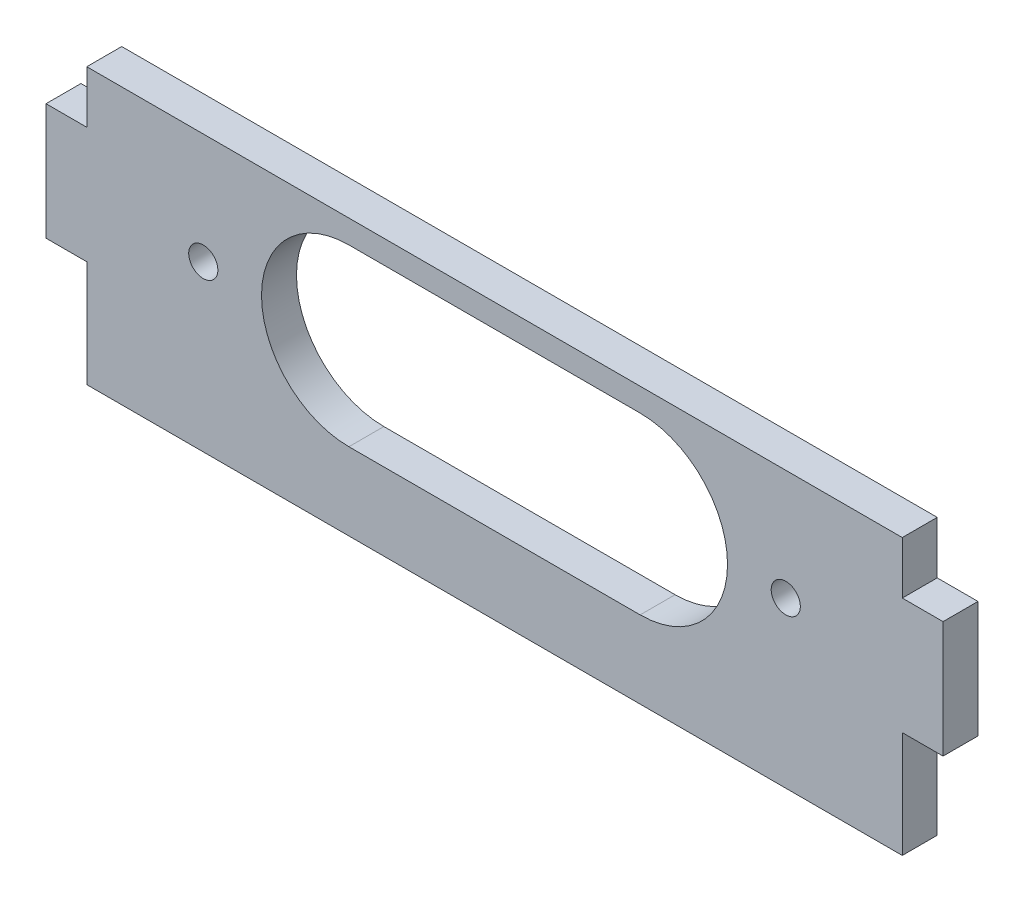
ISO-10303-21;
HEADER;
FILE_DESCRIPTION(('STEP AP214'),'2;1');
FILE_NAME('part.step','',(''),(''),'','','');
FILE_SCHEMA(('AUTOMOTIVE_DESIGN { 1 0 10303 214 1 1 1 1 }'));
ENDSEC;
DATA;
#1=APPLICATION_CONTEXT('core data for automotive mechanical design processes');
#2=APPLICATION_PROTOCOL_DEFINITION('international standard','automotive_design',2000,#1);
#3=PRODUCT_CONTEXT('',#1,'mechanical');
#4=PRODUCT('Part','Part','',(#3));
#5=PRODUCT_RELATED_PRODUCT_CATEGORY('part','',(#4));
#6=PRODUCT_DEFINITION_FORMATION('','',#4);
#7=PRODUCT_DEFINITION_CONTEXT('part definition',#1,'design');
#8=PRODUCT_DEFINITION('design','',#6,#7);
#9=PRODUCT_DEFINITION_SHAPE('','',#8);
#10=(LENGTH_UNIT() NAMED_UNIT(*) SI_UNIT(.MILLI.,.METRE.));
#11=(NAMED_UNIT(*) PLANE_ANGLE_UNIT() SI_UNIT($,.RADIAN.));
#12=(NAMED_UNIT(*) SI_UNIT($,.STERADIAN.) SOLID_ANGLE_UNIT());
#13=UNCERTAINTY_MEASURE_WITH_UNIT(LENGTH_MEASURE(1.E-05),#10,'distance_accuracy_value','');
#14=(GEOMETRIC_REPRESENTATION_CONTEXT(3) GLOBAL_UNCERTAINTY_ASSIGNED_CONTEXT((#13)) GLOBAL_UNIT_ASSIGNED_CONTEXT((#10,
#11,#12)) REPRESENTATION_CONTEXT('',''));
#15=CARTESIAN_POINT('',(0.,0.,0.));
#16=DIRECTION('',(0.,0.,1.));
#17=DIRECTION('',(1.,0.,0.));
#18=AXIS2_PLACEMENT_3D('',#15,#16,#17);
#19=CARTESIAN_POINT('',(0.,0.,6.));
#20=DIRECTION('',(0.,0.,1.));
#21=DIRECTION('',(1.,0.,0.));
#22=AXIS2_PLACEMENT_3D('',#19,#20,#21);
#23=PLANE('',#22);
#24=CARTESIAN_POINT('',(120.,-19.,6.));
#25=DIRECTION('',(0.,0.,1.));
#26=DIRECTION('',(1.,0.,0.));
#27=AXIS2_PLACEMENT_3D('',#24,#25,#26);
#28=CIRCLE('',#27,2.50000000000001);
#29=CARTESIAN_POINT('',(122.5,-19.,6.));
#30=VERTEX_POINT('',#29);
#31=EDGE_CURVE('E188',#30,#30,#28,.T.);
#32=ORIENTED_EDGE('',*,*,#31,.F.);
#33=EDGE_LOOP('',(#32));
#34=FACE_BOUND('',#33,.T.);
#35=DIRECTION('',(0.,1.,0.));
#36=VECTOR('',#35,1.);
#37=CARTESIAN_POINT('',(140.,-9.00000000000001,6.));
#38=LINE('',#37,#36);
#39=CARTESIAN_POINT('',(140.,-9.00000000000001,6.));
#40=VERTEX_POINT('',#39);
#41=CARTESIAN_POINT('',(140.,0.,6.));
#42=VERTEX_POINT('',#41);
#43=EDGE_CURVE('E204',#40,#42,#38,.T.);
#44=ORIENTED_EDGE('',*,*,#43,.T.);
#45=DIRECTION('',(-1.,0.,0.));
#46=VECTOR('',#45,1.);
#47=CARTESIAN_POINT('',(140.,0.,6.));
#48=LINE('',#47,#46);
#49=CARTESIAN_POINT('',(0.,0.,6.));
#50=VERTEX_POINT('',#49);
#51=EDGE_CURVE('E208',#42,#50,#48,.T.);
#52=ORIENTED_EDGE('',*,*,#51,.T.);
#53=DIRECTION('',(0.,-1.,0.));
#54=VECTOR('',#53,1.);
#55=CARTESIAN_POINT('',(0.,0.,6.));
#56=LINE('',#55,#54);
#57=CARTESIAN_POINT('',(0.,-9.00000000000001,6.));
#58=VERTEX_POINT('',#57);
#59=EDGE_CURVE('E212',#50,#58,#56,.T.);
#60=ORIENTED_EDGE('',*,*,#59,.T.);
#61=DIRECTION('',(-1.,0.,0.));
#62=VECTOR('',#61,1.);
#63=CARTESIAN_POINT('',(0.,-9.00000000000001,6.));
#64=LINE('',#63,#62);
#65=CARTESIAN_POINT('',(-7.00000000000001,-9.00000000000001,6.));
#66=VERTEX_POINT('',#65);
#67=EDGE_CURVE('E215',#58,#66,#64,.T.);
#68=ORIENTED_EDGE('',*,*,#67,.T.);
#69=DIRECTION('',(0.,-1.,0.));
#70=VECTOR('',#69,1.);
#71=CARTESIAN_POINT('',(-7.00000000000001,-9.00000000000001,6.));
#72=LINE('',#71,#70);
#73=CARTESIAN_POINT('',(-7.00000000000001,-29.,6.));
#74=VERTEX_POINT('',#73);
#75=EDGE_CURVE('E218',#66,#74,#72,.T.);
#76=ORIENTED_EDGE('',*,*,#75,.T.);
#77=DIRECTION('',(1.,0.,0.));
#78=VECTOR('',#77,1.);
#79=CARTESIAN_POINT('',(-7.00000000000001,-29.,6.));
#80=LINE('',#79,#78);
#81=CARTESIAN_POINT('',(0.,-29.,6.));
#82=VERTEX_POINT('',#81);
#83=EDGE_CURVE('E221',#74,#82,#80,.T.);
#84=ORIENTED_EDGE('',*,*,#83,.T.);
#85=DIRECTION('',(0.,-1.,0.));
#86=VECTOR('',#85,1.);
#87=CARTESIAN_POINT('',(0.,-29.,6.));
#88=LINE('',#87,#86);
#89=CARTESIAN_POINT('',(0.,-47.27,6.));
#90=VERTEX_POINT('',#89);
#91=EDGE_CURVE('E224',#82,#90,#88,.T.);
#92=ORIENTED_EDGE('',*,*,#91,.T.);
#93=DIRECTION('',(1.,0.,0.));
#94=VECTOR('',#93,1.);
#95=CARTESIAN_POINT('',(0.,-47.27,6.));
#96=LINE('',#95,#94);
#97=CARTESIAN_POINT('',(140.,-47.27,6.));
#98=VERTEX_POINT('',#97);
#99=EDGE_CURVE('E227',#90,#98,#96,.T.);
#100=ORIENTED_EDGE('',*,*,#99,.T.);
#101=DIRECTION('',(0.,1.,0.));
#102=VECTOR('',#101,1.);
#103=CARTESIAN_POINT('',(140.,-47.27,6.));
#104=LINE('',#103,#102);
#105=CARTESIAN_POINT('',(140.,-29.,6.));
#106=VERTEX_POINT('',#105);
#107=EDGE_CURVE('E230',#98,#106,#104,.T.);
#108=ORIENTED_EDGE('',*,*,#107,.T.);
#109=DIRECTION('',(1.,0.,0.));
#110=VECTOR('',#109,1.);
#111=CARTESIAN_POINT('',(140.,-29.,6.));
#112=LINE('',#111,#110);
#113=CARTESIAN_POINT('',(147.,-29.,6.));
#114=VERTEX_POINT('',#113);
#115=EDGE_CURVE('E233',#106,#114,#112,.T.);
#116=ORIENTED_EDGE('',*,*,#115,.T.);
#117=DIRECTION('',(0.,1.,0.));
#118=VECTOR('',#117,1.);
#119=CARTESIAN_POINT('',(147.,-29.,6.));
#120=LINE('',#119,#118);
#121=CARTESIAN_POINT('',(147.,-9.00000000000001,6.));
#122=VERTEX_POINT('',#121);
#123=EDGE_CURVE('E236',#114,#122,#120,.T.);
#124=ORIENTED_EDGE('',*,*,#123,.T.);
#125=DIRECTION('',(-1.,0.,0.));
#126=VECTOR('',#125,1.);
#127=CARTESIAN_POINT('',(147.,-9.00000000000001,6.));
#128=LINE('',#127,#126);
#129=EDGE_CURVE('E239',#122,#40,#128,.T.);
#130=ORIENTED_EDGE('',*,*,#129,.T.);
#131=EDGE_LOOP('',(#44,#52,#60,#68,#76,#84,#92,#100,#108,#116,#124,#130));
#132=FACE_BOUND('',#131,.T.);
#133=DIRECTION('',(-1.,0.,0.));
#134=VECTOR('',#133,1.);
#135=CARTESIAN_POINT('',(94.9999999999999,-4.,6.));
#136=LINE('',#135,#134);
#137=CARTESIAN_POINT('',(94.9999999999999,-4.,6.));
#138=VERTEX_POINT('',#137);
#139=CARTESIAN_POINT('',(44.9999999999999,-4.00000000000003,6.));
#140=VERTEX_POINT('',#139);
#141=EDGE_CURVE('E162',#138,#140,#136,.T.);
#142=ORIENTED_EDGE('',*,*,#141,.F.);
#143=CARTESIAN_POINT('',(94.9999999999999,-19.,6.));
#144=DIRECTION('',(0.,0.,1.));
#145=DIRECTION('',(1.,0.,0.));
#146=AXIS2_PLACEMENT_3D('',#143,#144,#145);
#147=CIRCLE('',#146,15.);
#148=CARTESIAN_POINT('',(94.9999999999999,-34.,6.));
#149=VERTEX_POINT('',#148);
#150=EDGE_CURVE('E153',#149,#138,#147,.T.);
#151=ORIENTED_EDGE('',*,*,#150,.F.);
#152=DIRECTION('',(1.,0.,0.));
#153=VECTOR('',#152,1.);
#154=CARTESIAN_POINT('',(44.9999999999999,-34.,6.));
#155=LINE('',#154,#153);
#156=CARTESIAN_POINT('',(44.9999999999999,-34.,6.));
#157=VERTEX_POINT('',#156);
#158=EDGE_CURVE('E180',#157,#149,#155,.T.);
#159=ORIENTED_EDGE('',*,*,#158,.F.);
#160=CARTESIAN_POINT('',(44.9999999999999,-19.,6.));
#161=DIRECTION('',(0.,0.,1.));
#162=DIRECTION('',(1.,0.,0.));
#163=AXIS2_PLACEMENT_3D('',#160,#161,#162);
#164=CIRCLE('',#163,15.);
#165=EDGE_CURVE('E176',#140,#157,#164,.T.);
#166=ORIENTED_EDGE('',*,*,#165,.F.);
#167=EDGE_LOOP('',(#142,#151,#159,#166));
#168=FACE_BOUND('',#167,.T.);
#169=CARTESIAN_POINT('',(19.9999999999999,-19.,6.));
#170=DIRECTION('',(0.,0.,1.));
#171=DIRECTION('',(1.,0.,0.));
#172=AXIS2_PLACEMENT_3D('',#169,#170,#171);
#173=CIRCLE('',#172,2.5);
#174=CARTESIAN_POINT('',(22.4999999999999,-19.,6.));
#175=VERTEX_POINT('',#174);
#176=EDGE_CURVE('E549',#175,#175,#173,.T.);
#177=ORIENTED_EDGE('',*,*,#176,.F.);
#178=EDGE_LOOP('',(#177));
#179=FACE_BOUND('',#178,.T.);
#180=ADVANCED_FACE('F39',(#34,#132,#168,#179),#23,.T.);
#181=CARTESIAN_POINT('',(0.,0.,0.));
#182=DIRECTION('',(0.,0.,1.));
#183=DIRECTION('',(1.,0.,0.));
#184=AXIS2_PLACEMENT_3D('',#181,#182,#183);
#185=PLANE('',#184);
#186=DIRECTION('',(0.,1.,0.));
#187=VECTOR('',#186,1.);
#188=CARTESIAN_POINT('',(140.,-9.00000000000001,0.));
#189=LINE('',#188,#187);
#190=CARTESIAN_POINT('',(140.,-9.00000000000001,0.));
#191=VERTEX_POINT('',#190);
#192=CARTESIAN_POINT('',(140.,0.,0.));
#193=VERTEX_POINT('',#192);
#194=EDGE_CURVE('E171',#191,#193,#189,.T.);
#195=ORIENTED_EDGE('',*,*,#194,.F.);
#196=DIRECTION('',(-1.,0.,0.));
#197=VECTOR('',#196,1.);
#198=CARTESIAN_POINT('',(147.,-9.00000000000001,0.));
#199=LINE('',#198,#197);
#200=CARTESIAN_POINT('',(147.,-9.00000000000001,0.));
#201=VERTEX_POINT('',#200);
#202=EDGE_CURVE('E209',#201,#191,#199,.T.);
#203=ORIENTED_EDGE('',*,*,#202,.F.);
#204=DIRECTION('',(0.,1.,0.));
#205=VECTOR('',#204,1.);
#206=CARTESIAN_POINT('',(147.,-29.,0.));
#207=LINE('',#206,#205);
#208=CARTESIAN_POINT('',(147.,-29.,0.));
#209=VERTEX_POINT('',#208);
#210=EDGE_CURVE('E273',#209,#201,#207,.T.);
#211=ORIENTED_EDGE('',*,*,#210,.F.);
#212=DIRECTION('',(1.,0.,0.));
#213=VECTOR('',#212,1.);
#214=CARTESIAN_POINT('',(140.,-29.,0.));
#215=LINE('',#214,#213);
#216=CARTESIAN_POINT('',(140.,-29.,0.));
#217=VERTEX_POINT('',#216);
#218=EDGE_CURVE('E270',#217,#209,#215,.T.);
#219=ORIENTED_EDGE('',*,*,#218,.F.);
#220=DIRECTION('',(0.,1.,0.));
#221=VECTOR('',#220,1.);
#222=CARTESIAN_POINT('',(140.,-47.27,0.));
#223=LINE('',#222,#221);
#224=CARTESIAN_POINT('',(140.,-47.27,0.));
#225=VERTEX_POINT('',#224);
#226=EDGE_CURVE('E267',#225,#217,#223,.T.);
#227=ORIENTED_EDGE('',*,*,#226,.F.);
#228=DIRECTION('',(1.,0.,0.));
#229=VECTOR('',#228,1.);
#230=CARTESIAN_POINT('',(0.,-47.27,0.));
#231=LINE('',#230,#229);
#232=CARTESIAN_POINT('',(0.,-47.27,0.));
#233=VERTEX_POINT('',#232);
#234=EDGE_CURVE('E264',#233,#225,#231,.T.);
#235=ORIENTED_EDGE('',*,*,#234,.F.);
#236=DIRECTION('',(0.,-1.,0.));
#237=VECTOR('',#236,1.);
#238=CARTESIAN_POINT('',(0.,-29.,0.));
#239=LINE('',#238,#237);
#240=CARTESIAN_POINT('',(0.,-29.,0.));
#241=VERTEX_POINT('',#240);
#242=EDGE_CURVE('E261',#241,#233,#239,.T.);
#243=ORIENTED_EDGE('',*,*,#242,.F.);
#244=DIRECTION('',(1.,0.,0.));
#245=VECTOR('',#244,1.);
#246=CARTESIAN_POINT('',(-7.00000000000001,-29.,0.));
#247=LINE('',#246,#245);
#248=CARTESIAN_POINT('',(-7.00000000000001,-29.,0.));
#249=VERTEX_POINT('',#248);
#250=EDGE_CURVE('E258',#249,#241,#247,.T.);
#251=ORIENTED_EDGE('',*,*,#250,.F.);
#252=DIRECTION('',(0.,-1.,0.));
#253=VECTOR('',#252,1.);
#254=CARTESIAN_POINT('',(-7.00000000000001,-9.00000000000001,0.));
#255=LINE('',#254,#253);
#256=CARTESIAN_POINT('',(-7.00000000000001,-9.00000000000001,0.));
#257=VERTEX_POINT('',#256);
#258=EDGE_CURVE('E255',#257,#249,#255,.T.);
#259=ORIENTED_EDGE('',*,*,#258,.F.);
#260=DIRECTION('',(-1.,0.,0.));
#261=VECTOR('',#260,1.);
#262=CARTESIAN_POINT('',(0.,-9.00000000000001,0.));
#263=LINE('',#262,#261);
#264=CARTESIAN_POINT('',(0.,-9.00000000000001,0.));
#265=VERTEX_POINT('',#264);
#266=EDGE_CURVE('E252',#265,#257,#263,.T.);
#267=ORIENTED_EDGE('',*,*,#266,.F.);
#268=DIRECTION('',(0.,-1.,0.));
#269=VECTOR('',#268,1.);
#270=CARTESIAN_POINT('',(0.,0.,0.));
#271=LINE('',#270,#269);
#272=CARTESIAN_POINT('',(0.,0.,0.));
#273=VERTEX_POINT('',#272);
#274=EDGE_CURVE('E249',#273,#265,#271,.T.);
#275=ORIENTED_EDGE('',*,*,#274,.F.);
#276=DIRECTION('',(-1.,0.,0.));
#277=VECTOR('',#276,1.);
#278=CARTESIAN_POINT('',(140.,0.,0.));
#279=LINE('',#278,#277);
#280=EDGE_CURVE('E246',#193,#273,#279,.T.);
#281=ORIENTED_EDGE('',*,*,#280,.F.);
#282=EDGE_LOOP('',(#195,#203,#211,#219,#227,#235,#243,#251,#259,#267,#275,#281));
#283=FACE_BOUND('',#282,.T.);
#284=CARTESIAN_POINT('',(94.9999999999999,-19.,0.));
#285=DIRECTION('',(0.,0.,1.));
#286=DIRECTION('',(1.,0.,0.));
#287=AXIS2_PLACEMENT_3D('',#284,#285,#286);
#288=CIRCLE('',#287,15.);
#289=CARTESIAN_POINT('',(94.9999999999999,-34.,0.));
#290=VERTEX_POINT('',#289);
#291=CARTESIAN_POINT('',(94.9999999999999,-4.,0.));
#292=VERTEX_POINT('',#291);
#293=EDGE_CURVE('E63',#290,#292,#288,.T.);
#294=ORIENTED_EDGE('',*,*,#293,.T.);
#295=DIRECTION('',(-1.,0.,0.));
#296=VECTOR('',#295,1.);
#297=CARTESIAN_POINT('',(94.9999999999999,-4.,0.));
#298=LINE('',#297,#296);
#299=CARTESIAN_POINT('',(44.9999999999999,-4.00000000000003,0.));
#300=VERTEX_POINT('',#299);
#301=EDGE_CURVE('E169',#292,#300,#298,.T.);
#302=ORIENTED_EDGE('',*,*,#301,.T.);
#303=CARTESIAN_POINT('',(44.9999999999999,-19.,0.));
#304=DIRECTION('',(0.,0.,1.));
#305=DIRECTION('',(1.,0.,0.));
#306=AXIS2_PLACEMENT_3D('',#303,#304,#305);
#307=CIRCLE('',#306,15.);
#308=CARTESIAN_POINT('',(44.9999999999999,-34.,0.));
#309=VERTEX_POINT('',#308);
#310=EDGE_CURVE('E191',#300,#309,#307,.T.);
#311=ORIENTED_EDGE('',*,*,#310,.T.);
#312=DIRECTION('',(1.,0.,0.));
#313=VECTOR('',#312,1.);
#314=CARTESIAN_POINT('',(44.9999999999999,-34.,0.));
#315=LINE('',#314,#313);
#316=EDGE_CURVE('E163',#309,#290,#315,.T.);
#317=ORIENTED_EDGE('',*,*,#316,.T.);
#318=EDGE_LOOP('',(#294,#302,#311,#317));
#319=FACE_BOUND('',#318,.T.);
#320=CARTESIAN_POINT('',(120.,-19.,0.));
#321=DIRECTION('',(0.,0.,1.));
#322=DIRECTION('',(1.,0.,0.));
#323=AXIS2_PLACEMENT_3D('',#320,#321,#322);
#324=CIRCLE('',#323,2.50000000000001);
#325=CARTESIAN_POINT('',(122.5,-19.,0.));
#326=VERTEX_POINT('',#325);
#327=EDGE_CURVE('E557',#326,#326,#324,.T.);
#328=ORIENTED_EDGE('',*,*,#327,.T.);
#329=EDGE_LOOP('',(#328));
#330=FACE_BOUND('',#329,.T.);
#331=CARTESIAN_POINT('',(19.9999999999999,-19.,0.));
#332=DIRECTION('',(0.,0.,1.));
#333=DIRECTION('',(1.,0.,0.));
#334=AXIS2_PLACEMENT_3D('',#331,#332,#333);
#335=CIRCLE('',#334,2.5);
#336=CARTESIAN_POINT('',(22.4999999999999,-19.,0.));
#337=VERTEX_POINT('',#336);
#338=EDGE_CURVE('E552',#337,#337,#335,.T.);
#339=ORIENTED_EDGE('',*,*,#338,.T.);
#340=EDGE_LOOP('',(#339));
#341=FACE_BOUND('',#340,.T.);
#342=ADVANCED_FACE('F328',(#283,#319,#330,#341),#185,.F.);
#343=CARTESIAN_POINT('',(140.,-9.00000000000001,6.));
#344=DIRECTION('',(-1.,0.,0.));
#345=DIRECTION('',(0.,0.,1.));
#346=AXIS2_PLACEMENT_3D('',#343,#344,#345);
#347=PLANE('',#346);
#348=ORIENTED_EDGE('',*,*,#194,.T.);
#349=DIRECTION('',(0.,0.,-1.));
#350=VECTOR('',#349,1.);
#351=CARTESIAN_POINT('',(140.,0.,6.));
#352=LINE('',#351,#350);
#353=EDGE_CURVE('E11',#42,#193,#352,.T.);
#354=ORIENTED_EDGE('',*,*,#353,.F.);
#355=ORIENTED_EDGE('',*,*,#43,.F.);
#356=DIRECTION('',(0.,0.,-1.));
#357=VECTOR('',#356,1.);
#358=CARTESIAN_POINT('',(140.,-9.00000000000001,6.));
#359=LINE('',#358,#357);
#360=EDGE_CURVE('E242',#40,#191,#359,.T.);
#361=ORIENTED_EDGE('',*,*,#360,.T.);
#362=EDGE_LOOP('',(#348,#354,#355,#361));
#363=FACE_BOUND('',#362,.T.);
#364=ADVANCED_FACE('F41',(#363),#347,.F.);
#365=CARTESIAN_POINT('',(140.,0.,6.));
#366=DIRECTION('',(0.,-1.,0.));
#367=DIRECTION('',(0.,0.,-1.));
#368=AXIS2_PLACEMENT_3D('',#365,#366,#367);
#369=PLANE('',#368);
#370=ORIENTED_EDGE('',*,*,#280,.T.);
#371=DIRECTION('',(0.,0.,-1.));
#372=VECTOR('',#371,1.);
#373=CARTESIAN_POINT('',(0.,0.,6.));
#374=LINE('',#373,#372);
#375=EDGE_CURVE('E48',#50,#273,#374,.T.);
#376=ORIENTED_EDGE('',*,*,#375,.F.);
#377=ORIENTED_EDGE('',*,*,#51,.F.);
#378=ORIENTED_EDGE('',*,*,#353,.T.);
#379=EDGE_LOOP('',(#370,#376,#377,#378));
#380=FACE_BOUND('',#379,.T.);
#381=ADVANCED_FACE('F345',(#380),#369,.F.);
#382=CARTESIAN_POINT('',(0.,0.,6.));
#383=DIRECTION('',(1.,0.,0.));
#384=DIRECTION('',(0.,0.,-1.));
#385=AXIS2_PLACEMENT_3D('',#382,#383,#384);
#386=PLANE('',#385);
#387=ORIENTED_EDGE('',*,*,#274,.T.);
#388=DIRECTION('',(0.,0.,-1.));
#389=VECTOR('',#388,1.);
#390=CARTESIAN_POINT('',(0.,-9.00000000000001,6.));
#391=LINE('',#390,#389);
#392=EDGE_CURVE('E313',#58,#265,#391,.T.);
#393=ORIENTED_EDGE('',*,*,#392,.F.);
#394=ORIENTED_EDGE('',*,*,#59,.F.);
#395=ORIENTED_EDGE('',*,*,#375,.T.);
#396=EDGE_LOOP('',(#387,#393,#394,#395));
#397=FACE_BOUND('',#396,.T.);
#398=ADVANCED_FACE('F322',(#397),#386,.F.);
#399=CARTESIAN_POINT('',(0.,-9.00000000000001,6.));
#400=DIRECTION('',(0.,-1.,0.));
#401=DIRECTION('',(0.,0.,-1.));
#402=AXIS2_PLACEMENT_3D('',#399,#400,#401);
#403=PLANE('',#402);
#404=ORIENTED_EDGE('',*,*,#266,.T.);
#405=DIRECTION('',(0.,0.,-1.));
#406=VECTOR('',#405,1.);
#407=CARTESIAN_POINT('',(-7.00000000000001,-9.00000000000001,6.));
#408=LINE('',#407,#406);
#409=EDGE_CURVE('E309',#66,#257,#408,.T.);
#410=ORIENTED_EDGE('',*,*,#409,.F.);
#411=ORIENTED_EDGE('',*,*,#67,.F.);
#412=ORIENTED_EDGE('',*,*,#392,.T.);
#413=EDGE_LOOP('',(#404,#410,#411,#412));
#414=FACE_BOUND('',#413,.T.);
#415=ADVANCED_FACE('F334',(#414),#403,.F.);
#416=CARTESIAN_POINT('',(-7.00000000000001,-9.00000000000001,6.));
#417=DIRECTION('',(1.,0.,0.));
#418=DIRECTION('',(0.,0.,-1.));
#419=AXIS2_PLACEMENT_3D('',#416,#417,#418);
#420=PLANE('',#419);
#421=ORIENTED_EDGE('',*,*,#258,.T.);
#422=DIRECTION('',(0.,0.,-1.));
#423=VECTOR('',#422,1.);
#424=CARTESIAN_POINT('',(-7.00000000000001,-29.,6.));
#425=LINE('',#424,#423);
#426=EDGE_CURVE('E305',#74,#249,#425,.T.);
#427=ORIENTED_EDGE('',*,*,#426,.F.);
#428=ORIENTED_EDGE('',*,*,#75,.F.);
#429=ORIENTED_EDGE('',*,*,#409,.T.);
#430=EDGE_LOOP('',(#421,#427,#428,#429));
#431=FACE_BOUND('',#430,.T.);
#432=ADVANCED_FACE('F338',(#431),#420,.F.);
#433=CARTESIAN_POINT('',(-7.00000000000001,-29.,6.));
#434=DIRECTION('',(0.,1.,0.));
#435=DIRECTION('',(0.,0.,1.));
#436=AXIS2_PLACEMENT_3D('',#433,#434,#435);
#437=PLANE('',#436);
#438=ORIENTED_EDGE('',*,*,#250,.T.);
#439=DIRECTION('',(0.,0.,-1.));
#440=VECTOR('',#439,1.);
#441=CARTESIAN_POINT('',(0.,-29.,6.));
#442=LINE('',#441,#440);
#443=EDGE_CURVE('E301',#82,#241,#442,.T.);
#444=ORIENTED_EDGE('',*,*,#443,.F.);
#445=ORIENTED_EDGE('',*,*,#83,.F.);
#446=ORIENTED_EDGE('',*,*,#426,.T.);
#447=EDGE_LOOP('',(#438,#444,#445,#446));
#448=FACE_BOUND('',#447,.T.);
#449=ADVANCED_FACE('F378',(#448),#437,.F.);
#450=CARTESIAN_POINT('',(0.,-29.,6.));
#451=DIRECTION('',(1.,0.,0.));
#452=DIRECTION('',(0.,0.,-1.));
#453=AXIS2_PLACEMENT_3D('',#450,#451,#452);
#454=PLANE('',#453);
#455=ORIENTED_EDGE('',*,*,#242,.T.);
#456=DIRECTION('',(0.,0.,-1.));
#457=VECTOR('',#456,1.);
#458=CARTESIAN_POINT('',(0.,-47.27,6.));
#459=LINE('',#458,#457);
#460=EDGE_CURVE('E297',#90,#233,#459,.T.);
#461=ORIENTED_EDGE('',*,*,#460,.F.);
#462=ORIENTED_EDGE('',*,*,#91,.F.);
#463=ORIENTED_EDGE('',*,*,#443,.T.);
#464=EDGE_LOOP('',(#455,#461,#462,#463));
#465=FACE_BOUND('',#464,.T.);
#466=ADVANCED_FACE('F376',(#465),#454,.F.);
#467=CARTESIAN_POINT('',(0.,-47.27,6.));
#468=DIRECTION('',(0.,1.,0.));
#469=DIRECTION('',(0.,0.,1.));
#470=AXIS2_PLACEMENT_3D('',#467,#468,#469);
#471=PLANE('',#470);
#472=ORIENTED_EDGE('',*,*,#234,.T.);
#473=DIRECTION('',(0.,0.,-1.));
#474=VECTOR('',#473,1.);
#475=CARTESIAN_POINT('',(140.,-47.27,6.));
#476=LINE('',#475,#474);
#477=EDGE_CURVE('E293',#98,#225,#476,.T.);
#478=ORIENTED_EDGE('',*,*,#477,.F.);
#479=ORIENTED_EDGE('',*,*,#99,.F.);
#480=ORIENTED_EDGE('',*,*,#460,.T.);
#481=EDGE_LOOP('',(#472,#478,#479,#480));
#482=FACE_BOUND('',#481,.T.);
#483=ADVANCED_FACE('F372',(#482),#471,.F.);
#484=CARTESIAN_POINT('',(140.,-47.27,6.));
#485=DIRECTION('',(-1.,0.,0.));
#486=DIRECTION('',(0.,0.,1.));
#487=AXIS2_PLACEMENT_3D('',#484,#485,#486);
#488=PLANE('',#487);
#489=ORIENTED_EDGE('',*,*,#226,.T.);
#490=DIRECTION('',(0.,0.,-1.));
#491=VECTOR('',#490,1.);
#492=CARTESIAN_POINT('',(140.,-29.,6.));
#493=LINE('',#492,#491);
#494=EDGE_CURVE('E289',#106,#217,#493,.T.);
#495=ORIENTED_EDGE('',*,*,#494,.F.);
#496=ORIENTED_EDGE('',*,*,#107,.F.);
#497=ORIENTED_EDGE('',*,*,#477,.T.);
#498=EDGE_LOOP('',(#489,#495,#496,#497));
#499=FACE_BOUND('',#498,.T.);
#500=ADVANCED_FACE('F367',(#499),#488,.F.);
#501=CARTESIAN_POINT('',(140.,-29.,6.));
#502=DIRECTION('',(0.,1.,0.));
#503=DIRECTION('',(0.,0.,1.));
#504=AXIS2_PLACEMENT_3D('',#501,#502,#503);
#505=PLANE('',#504);
#506=ORIENTED_EDGE('',*,*,#218,.T.);
#507=DIRECTION('',(0.,0.,-1.));
#508=VECTOR('',#507,1.);
#509=CARTESIAN_POINT('',(147.,-29.,6.));
#510=LINE('',#509,#508);
#511=EDGE_CURVE('E285',#114,#209,#510,.T.);
#512=ORIENTED_EDGE('',*,*,#511,.F.);
#513=ORIENTED_EDGE('',*,*,#115,.F.);
#514=ORIENTED_EDGE('',*,*,#494,.T.);
#515=EDGE_LOOP('',(#506,#512,#513,#514));
#516=FACE_BOUND('',#515,.T.);
#517=ADVANCED_FACE('F361',(#516),#505,.F.);
#518=CARTESIAN_POINT('',(147.,-29.,6.));
#519=DIRECTION('',(-1.,0.,0.));
#520=DIRECTION('',(0.,0.,1.));
#521=AXIS2_PLACEMENT_3D('',#518,#519,#520);
#522=PLANE('',#521);
#523=ORIENTED_EDGE('',*,*,#210,.T.);
#524=DIRECTION('',(0.,0.,-1.));
#525=VECTOR('',#524,1.);
#526=CARTESIAN_POINT('',(147.,-9.00000000000001,6.));
#527=LINE('',#526,#525);
#528=EDGE_CURVE('E281',#122,#201,#527,.T.);
#529=ORIENTED_EDGE('',*,*,#528,.F.);
#530=ORIENTED_EDGE('',*,*,#123,.F.);
#531=ORIENTED_EDGE('',*,*,#511,.T.);
#532=EDGE_LOOP('',(#523,#529,#530,#531));
#533=FACE_BOUND('',#532,.T.);
#534=ADVANCED_FACE('F357',(#533),#522,.F.);
#535=CARTESIAN_POINT('',(147.,-9.00000000000001,6.));
#536=DIRECTION('',(0.,-1.,0.));
#537=DIRECTION('',(0.,0.,-1.));
#538=AXIS2_PLACEMENT_3D('',#535,#536,#537);
#539=PLANE('',#538);
#540=ORIENTED_EDGE('',*,*,#202,.T.);
#541=ORIENTED_EDGE('',*,*,#360,.F.);
#542=ORIENTED_EDGE('',*,*,#129,.F.);
#543=ORIENTED_EDGE('',*,*,#528,.T.);
#544=EDGE_LOOP('',(#540,#541,#542,#543));
#545=FACE_BOUND('',#544,.T.);
#546=ADVANCED_FACE('F352',(#545),#539,.F.);
#547=CARTESIAN_POINT('',(94.9999999999999,-19.,6.));
#548=DIRECTION('',(0.,0.,-1.));
#549=DIRECTION('',(-1.,0.,0.));
#550=AXIS2_PLACEMENT_3D('',#547,#548,#549);
#551=CYLINDRICAL_SURFACE('',#550,15.);
#552=ORIENTED_EDGE('',*,*,#293,.F.);
#553=DIRECTION('',(0.,0.,-1.));
#554=VECTOR('',#553,1.);
#555=CARTESIAN_POINT('',(94.9999999999999,-34.,6.));
#556=LINE('',#555,#554);
#557=EDGE_CURVE('E157',#149,#290,#556,.T.);
#558=ORIENTED_EDGE('',*,*,#557,.F.);
#559=ORIENTED_EDGE('',*,*,#150,.T.);
#560=DIRECTION('',(0.,0.,-1.));
#561=VECTOR('',#560,1.);
#562=CARTESIAN_POINT('',(94.9999999999999,-4.,6.));
#563=LINE('',#562,#561);
#564=EDGE_CURVE('E156',#138,#292,#563,.T.);
#565=ORIENTED_EDGE('',*,*,#564,.T.);
#566=EDGE_LOOP('',(#552,#558,#559,#565));
#567=FACE_BOUND('',#566,.T.);
#568=ADVANCED_FACE('F155',(#567),#551,.F.);
#569=CARTESIAN_POINT('',(94.9999999999999,-4.,6.));
#570=DIRECTION('',(0.,-1.,0.));
#571=DIRECTION('',(1.,0.,0.));
#572=AXIS2_PLACEMENT_3D('',#569,#570,#571);
#573=PLANE('',#572);
#574=ORIENTED_EDGE('',*,*,#301,.F.);
#575=ORIENTED_EDGE('',*,*,#564,.F.);
#576=ORIENTED_EDGE('',*,*,#141,.T.);
#577=DIRECTION('',(0.,0.,-1.));
#578=VECTOR('',#577,1.);
#579=CARTESIAN_POINT('',(44.9999999999999,-4.00000000000003,6.));
#580=LINE('',#579,#578);
#581=EDGE_CURVE('E172',#140,#300,#580,.T.);
#582=ORIENTED_EDGE('',*,*,#581,.T.);
#583=EDGE_LOOP('',(#574,#575,#576,#582));
#584=FACE_BOUND('',#583,.T.);
#585=ADVANCED_FACE('F166',(#584),#573,.T.);
#586=CARTESIAN_POINT('',(44.9999999999999,-19.,6.));
#587=DIRECTION('',(0.,0.,-1.));
#588=DIRECTION('',(-1.,0.,0.));
#589=AXIS2_PLACEMENT_3D('',#586,#587,#588);
#590=CYLINDRICAL_SURFACE('',#589,15.);
#591=ORIENTED_EDGE('',*,*,#310,.F.);
#592=ORIENTED_EDGE('',*,*,#581,.F.);
#593=ORIENTED_EDGE('',*,*,#165,.T.);
#594=DIRECTION('',(0.,0.,-1.));
#595=VECTOR('',#594,1.);
#596=CARTESIAN_POINT('',(44.9999999999999,-34.,6.));
#597=LINE('',#596,#595);
#598=EDGE_CURVE('E55',#157,#309,#597,.T.);
#599=ORIENTED_EDGE('',*,*,#598,.T.);
#600=EDGE_LOOP('',(#591,#592,#593,#599));
#601=FACE_BOUND('',#600,.T.);
#602=ADVANCED_FACE('F438',(#601),#590,.F.);
#603=CARTESIAN_POINT('',(44.9999999999999,-34.,6.));
#604=DIRECTION('',(0.,1.,0.));
#605=DIRECTION('',(-1.,0.,0.));
#606=AXIS2_PLACEMENT_3D('',#603,#604,#605);
#607=PLANE('',#606);
#608=ORIENTED_EDGE('',*,*,#316,.F.);
#609=ORIENTED_EDGE('',*,*,#598,.F.);
#610=ORIENTED_EDGE('',*,*,#158,.T.);
#611=ORIENTED_EDGE('',*,*,#557,.T.);
#612=EDGE_LOOP('',(#608,#609,#610,#611));
#613=FACE_BOUND('',#612,.T.);
#614=ADVANCED_FACE('F444',(#613),#607,.T.);
#615=CARTESIAN_POINT('',(120.,-19.,6.));
#616=DIRECTION('',(0.,0.,-1.));
#617=DIRECTION('',(-1.,0.,0.));
#618=AXIS2_PLACEMENT_3D('',#615,#616,#617);
#619=CYLINDRICAL_SURFACE('',#618,2.50000000000001);
#620=ORIENTED_EDGE('',*,*,#31,.T.);
#621=EDGE_LOOP('',(#620));
#622=FACE_BOUND('',#621,.T.);
#623=ORIENTED_EDGE('',*,*,#327,.F.);
#624=EDGE_LOOP('',(#623));
#625=FACE_BOUND('',#624,.T.);
#626=ADVANCED_FACE('F452',(#622,#625),#619,.F.);
#627=CARTESIAN_POINT('',(19.9999999999999,-19.,6.));
#628=DIRECTION('',(0.,0.,-1.));
#629=DIRECTION('',(-1.,0.,0.));
#630=AXIS2_PLACEMENT_3D('',#627,#628,#629);
#631=CYLINDRICAL_SURFACE('',#630,2.5);
#632=ORIENTED_EDGE('',*,*,#176,.T.);
#633=EDGE_LOOP('',(#632));
#634=FACE_BOUND('',#633,.T.);
#635=ORIENTED_EDGE('',*,*,#338,.F.);
#636=EDGE_LOOP('',(#635));
#637=FACE_BOUND('',#636,.T.);
#638=ADVANCED_FACE('F459',(#634,#637),#631,.F.);
#639=CLOSED_SHELL('',(#180,#342,#364,#381,#398,#415,#432,#449,#466,#483,#500,#517,#534,#546,
#568,#585,#602,#614,#626,#638));
#640=MANIFOLD_SOLID_BREP('B2',#639);
#641=ADVANCED_BREP_SHAPE_REPRESENTATION('',(#18,#640),#14);
#642=SHAPE_DEFINITION_REPRESENTATION(#9,#641);
ENDSEC;
END-ISO-10303-21;
